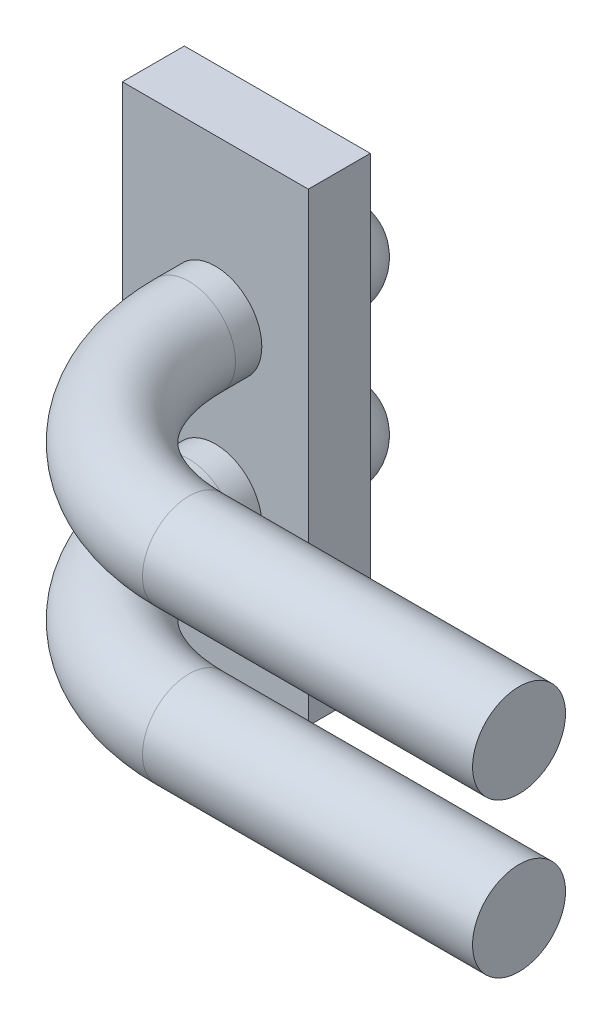
ISO-10303-21;
HEADER;
FILE_DESCRIPTION(('STEP AP214'),'2;1');
FILE_NAME('part.step','',(''),(''),'','','');
FILE_SCHEMA(('AUTOMOTIVE_DESIGN { 1 0 10303 214 1 1 1 1 }'));
ENDSEC;
DATA;
#1=APPLICATION_CONTEXT('core data for automotive mechanical design processes');
#2=APPLICATION_PROTOCOL_DEFINITION('international standard','automotive_design',2000,#1);
#3=PRODUCT_CONTEXT('',#1,'mechanical');
#4=PRODUCT('Part','Part','',(#3));
#5=PRODUCT_RELATED_PRODUCT_CATEGORY('part','',(#4));
#6=PRODUCT_DEFINITION_FORMATION('','',#4);
#7=PRODUCT_DEFINITION_CONTEXT('part definition',#1,'design');
#8=PRODUCT_DEFINITION('design','',#6,#7);
#9=PRODUCT_DEFINITION_SHAPE('','',#8);
#10=(LENGTH_UNIT() NAMED_UNIT(*) SI_UNIT(.MILLI.,.METRE.));
#11=(NAMED_UNIT(*) PLANE_ANGLE_UNIT() SI_UNIT($,.RADIAN.));
#12=(NAMED_UNIT(*) SI_UNIT($,.STERADIAN.) SOLID_ANGLE_UNIT());
#13=UNCERTAINTY_MEASURE_WITH_UNIT(LENGTH_MEASURE(1.E-05),#10,'distance_accuracy_value','');
#14=(GEOMETRIC_REPRESENTATION_CONTEXT(3) GLOBAL_UNCERTAINTY_ASSIGNED_CONTEXT((#13)) GLOBAL_UNIT_ASSIGNED_CONTEXT((#10,
#11,#12)) REPRESENTATION_CONTEXT('',''));
#15=CARTESIAN_POINT('',(0.,0.,0.));
#16=DIRECTION('',(0.,0.,1.));
#17=DIRECTION('',(1.,0.,0.));
#18=AXIS2_PLACEMENT_3D('',#15,#16,#17);
#19=CARTESIAN_POINT('',(3.00000000000001,7.5,2.));
#20=DIRECTION('',(0.,0.,-1.));
#21=DIRECTION('',(-1.,0.,0.));
#22=AXIS2_PLACEMENT_3D('',#19,#20,#21);
#23=PLANE('',#22);
#24=CARTESIAN_POINT('',(0.,-2.62,2.));
#25=DIRECTION('',(0.,0.,1.));
#26=DIRECTION('',(1.,0.,0.));
#27=AXIS2_PLACEMENT_3D('',#24,#25,#26);
#28=CIRCLE('',#27,1.5);
#29=CARTESIAN_POINT('',(1.5,-2.62,2.));
#30=VERTEX_POINT('',#29);
#31=EDGE_CURVE('E41',#30,#30,#28,.T.);
#32=ORIENTED_EDGE('',*,*,#31,.F.);
#33=EDGE_LOOP('',(#32));
#34=FACE_BOUND('',#33,.T.);
#35=DIRECTION('',(0.,1.,0.));
#36=VECTOR('',#35,1.);
#37=CARTESIAN_POINT('',(3.00000000000001,-7.5,2.));
#38=LINE('',#37,#36);
#39=CARTESIAN_POINT('',(3.00000000000001,-7.5,2.));
#40=VERTEX_POINT('',#39);
#41=CARTESIAN_POINT('',(3.00000000000001,7.5,2.));
#42=VERTEX_POINT('',#41);
#43=EDGE_CURVE('E86',#40,#42,#38,.T.);
#44=ORIENTED_EDGE('',*,*,#43,.T.);
#45=DIRECTION('',(-1.,0.,0.));
#46=VECTOR('',#45,1.);
#47=CARTESIAN_POINT('',(-3.,7.5,2.));
#48=LINE('',#47,#46);
#49=CARTESIAN_POINT('',(-3.,7.5,2.));
#50=VERTEX_POINT('',#49);
#51=EDGE_CURVE('E81',#42,#50,#48,.T.);
#52=ORIENTED_EDGE('',*,*,#51,.T.);
#53=DIRECTION('',(0.,-1.,0.));
#54=VECTOR('',#53,1.);
#55=CARTESIAN_POINT('',(-3.,-7.5,2.));
#56=LINE('',#55,#54);
#57=CARTESIAN_POINT('',(-3.,-7.5,2.));
#58=VERTEX_POINT('',#57);
#59=EDGE_CURVE('E84',#50,#58,#56,.T.);
#60=ORIENTED_EDGE('',*,*,#59,.T.);
#61=DIRECTION('',(1.,0.,0.));
#62=VECTOR('',#61,1.);
#63=CARTESIAN_POINT('',(-3.,-7.5,2.));
#64=LINE('',#63,#62);
#65=EDGE_CURVE('E50',#58,#40,#64,.T.);
#66=ORIENTED_EDGE('',*,*,#65,.T.);
#67=EDGE_LOOP('',(#44,#52,#60,#66));
#68=FACE_BOUND('',#67,.T.);
#69=CARTESIAN_POINT('',(0.,2.35,2.));
#70=DIRECTION('',(0.,0.,1.));
#71=DIRECTION('',(1.,0.,0.));
#72=AXIS2_PLACEMENT_3D('',#69,#70,#71);
#73=CIRCLE('',#72,1.5);
#74=CARTESIAN_POINT('',(1.5,2.35,2.));
#75=VERTEX_POINT('',#74);
#76=EDGE_CURVE('E11',#75,#75,#73,.T.);
#77=ORIENTED_EDGE('',*,*,#76,.F.);
#78=EDGE_LOOP('',(#77));
#79=FACE_BOUND('',#78,.T.);
#80=ADVANCED_FACE('F31',(#34,#68,#79),#23,.F.);
#81=CARTESIAN_POINT('',(3.00000000000001,7.5,0.));
#82=DIRECTION('',(0.,0.,-1.));
#83=DIRECTION('',(-1.,0.,0.));
#84=AXIS2_PLACEMENT_3D('',#81,#82,#83);
#85=PLANE('',#84);
#86=CARTESIAN_POINT('',(0.,2.35,0.));
#87=DIRECTION('',(0.,0.,-1.));
#88=DIRECTION('',(-1.,0.,0.));
#89=AXIS2_PLACEMENT_3D('',#86,#87,#88);
#90=CIRCLE('',#89,1.5);
#91=CARTESIAN_POINT('',(-1.5,2.35,0.));
#92=VERTEX_POINT('',#91);
#93=EDGE_CURVE('E104',#92,#92,#90,.T.);
#94=ORIENTED_EDGE('',*,*,#93,.F.);
#95=EDGE_LOOP('',(#94));
#96=FACE_BOUND('',#95,.T.);
#97=DIRECTION('',(0.,1.,0.));
#98=VECTOR('',#97,1.);
#99=CARTESIAN_POINT('',(3.00000000000001,-7.5,0.));
#100=LINE('',#99,#98);
#101=CARTESIAN_POINT('',(3.00000000000001,-7.5,0.));
#102=VERTEX_POINT('',#101);
#103=CARTESIAN_POINT('',(3.00000000000001,7.5,0.));
#104=VERTEX_POINT('',#103);
#105=EDGE_CURVE('E101',#102,#104,#100,.T.);
#106=ORIENTED_EDGE('',*,*,#105,.F.);
#107=DIRECTION('',(1.,0.,0.));
#108=VECTOR('',#107,1.);
#109=CARTESIAN_POINT('',(-3.,-7.5,0.));
#110=LINE('',#109,#108);
#111=CARTESIAN_POINT('',(-3.,-7.5,0.));
#112=VERTEX_POINT('',#111);
#113=EDGE_CURVE('E73',#112,#102,#110,.T.);
#114=ORIENTED_EDGE('',*,*,#113,.F.);
#115=DIRECTION('',(0.,-1.,0.));
#116=VECTOR('',#115,1.);
#117=CARTESIAN_POINT('',(-3.,-7.5,0.));
#118=LINE('',#117,#116);
#119=CARTESIAN_POINT('',(-3.,7.5,0.));
#120=VERTEX_POINT('',#119);
#121=EDGE_CURVE('E67',#120,#112,#118,.T.);
#122=ORIENTED_EDGE('',*,*,#121,.F.);
#123=DIRECTION('',(-1.,0.,0.));
#124=VECTOR('',#123,1.);
#125=CARTESIAN_POINT('',(-3.,7.5,0.));
#126=LINE('',#125,#124);
#127=EDGE_CURVE('E91',#104,#120,#126,.T.);
#128=ORIENTED_EDGE('',*,*,#127,.F.);
#129=EDGE_LOOP('',(#106,#114,#122,#128));
#130=FACE_BOUND('',#129,.T.);
#131=CARTESIAN_POINT('',(0.,-2.62,0.));
#132=DIRECTION('',(0.,0.,-1.));
#133=DIRECTION('',(-1.,0.,0.));
#134=AXIS2_PLACEMENT_3D('',#131,#132,#133);
#135=CIRCLE('',#134,1.5);
#136=CARTESIAN_POINT('',(-1.5,-2.62,0.));
#137=VERTEX_POINT('',#136);
#138=EDGE_CURVE('E131',#137,#137,#135,.T.);
#139=ORIENTED_EDGE('',*,*,#138,.F.);
#140=EDGE_LOOP('',(#139));
#141=FACE_BOUND('',#140,.T.);
#142=ADVANCED_FACE('F139',(#96,#130,#141),#85,.T.);
#143=CARTESIAN_POINT('',(3.00000000000001,-7.5,2.));
#144=DIRECTION('',(-1.,0.,0.));
#145=DIRECTION('',(0.,0.,1.));
#146=AXIS2_PLACEMENT_3D('',#143,#144,#145);
#147=PLANE('',#146);
#148=ORIENTED_EDGE('',*,*,#105,.T.);
#149=DIRECTION('',(0.,0.,-1.));
#150=VECTOR('',#149,1.);
#151=CARTESIAN_POINT('',(3.00000000000001,7.5,2.));
#152=LINE('',#151,#150);
#153=EDGE_CURVE('E92',#42,#104,#152,.T.);
#154=ORIENTED_EDGE('',*,*,#153,.F.);
#155=ORIENTED_EDGE('',*,*,#43,.F.);
#156=DIRECTION('',(0.,0.,-1.));
#157=VECTOR('',#156,1.);
#158=CARTESIAN_POINT('',(3.00000000000001,-7.5,2.));
#159=LINE('',#158,#157);
#160=EDGE_CURVE('E97',#40,#102,#159,.T.);
#161=ORIENTED_EDGE('',*,*,#160,.T.);
#162=EDGE_LOOP('',(#148,#154,#155,#161));
#163=FACE_BOUND('',#162,.T.);
#164=ADVANCED_FACE('F142',(#163),#147,.F.);
#165=CARTESIAN_POINT('',(-3.,7.5,2.));
#166=DIRECTION('',(0.,-1.,0.));
#167=DIRECTION('',(0.,0.,-1.));
#168=AXIS2_PLACEMENT_3D('',#165,#166,#167);
#169=PLANE('',#168);
#170=ORIENTED_EDGE('',*,*,#127,.T.);
#171=DIRECTION('',(0.,0.,-1.));
#172=VECTOR('',#171,1.);
#173=CARTESIAN_POINT('',(-3.,7.5,2.));
#174=LINE('',#173,#172);
#175=EDGE_CURVE('E89',#50,#120,#174,.T.);
#176=ORIENTED_EDGE('',*,*,#175,.F.);
#177=ORIENTED_EDGE('',*,*,#51,.F.);
#178=ORIENTED_EDGE('',*,*,#153,.T.);
#179=EDGE_LOOP('',(#170,#176,#177,#178));
#180=FACE_BOUND('',#179,.T.);
#181=ADVANCED_FACE('F90',(#180),#169,.F.);
#182=CARTESIAN_POINT('',(-3.,-7.5,2.));
#183=DIRECTION('',(1.,0.,0.));
#184=DIRECTION('',(0.,0.,-1.));
#185=AXIS2_PLACEMENT_3D('',#182,#183,#184);
#186=PLANE('',#185);
#187=ORIENTED_EDGE('',*,*,#121,.T.);
#188=DIRECTION('',(0.,0.,-1.));
#189=VECTOR('',#188,1.);
#190=CARTESIAN_POINT('',(-3.,-7.5,2.));
#191=LINE('',#190,#189);
#192=EDGE_CURVE('E93',#58,#112,#191,.T.);
#193=ORIENTED_EDGE('',*,*,#192,.F.);
#194=ORIENTED_EDGE('',*,*,#59,.F.);
#195=ORIENTED_EDGE('',*,*,#175,.T.);
#196=EDGE_LOOP('',(#187,#193,#194,#195));
#197=FACE_BOUND('',#196,.T.);
#198=ADVANCED_FACE('F95',(#197),#186,.F.);
#199=CARTESIAN_POINT('',(-3.,-7.5,2.));
#200=DIRECTION('',(0.,1.,0.));
#201=DIRECTION('',(0.,0.,1.));
#202=AXIS2_PLACEMENT_3D('',#199,#200,#201);
#203=PLANE('',#202);
#204=ORIENTED_EDGE('',*,*,#113,.T.);
#205=ORIENTED_EDGE('',*,*,#160,.F.);
#206=ORIENTED_EDGE('',*,*,#65,.F.);
#207=ORIENTED_EDGE('',*,*,#192,.T.);
#208=EDGE_LOOP('',(#204,#205,#206,#207));
#209=FACE_BOUND('',#208,.T.);
#210=ADVANCED_FACE('F157',(#209),#203,.F.);
#211=CARTESIAN_POINT('',(0.,2.35,-3.));
#212=DIRECTION('',(0.,0.,1.));
#213=DIRECTION('',(1.,0.,0.));
#214=AXIS2_PLACEMENT_3D('',#211,#212,#213);
#215=CYLINDRICAL_SURFACE('',#214,1.5);
#216=CARTESIAN_POINT('',(0.,2.35,-1.5));
#217=DIRECTION('',(0.,0.,1.));
#218=DIRECTION('',(1.,0.,0.));
#219=AXIS2_PLACEMENT_3D('',#216,#217,#218);
#220=CIRCLE('',#219,1.5);
#221=CARTESIAN_POINT('',(1.5,2.35,-1.5));
#222=VERTEX_POINT('',#221);
#223=EDGE_CURVE('E35',#222,#222,#220,.T.);
#224=ORIENTED_EDGE('',*,*,#223,.T.);
#225=EDGE_LOOP('',(#224));
#226=FACE_BOUND('',#225,.T.);
#227=ORIENTED_EDGE('',*,*,#93,.T.);
#228=EDGE_LOOP('',(#227));
#229=FACE_BOUND('',#228,.T.);
#230=ADVANCED_FACE('F137',(#226,#229),#215,.T.);
#231=CARTESIAN_POINT('',(0.,-2.62,-3.));
#232=DIRECTION('',(0.,0.,1.));
#233=DIRECTION('',(1.,0.,0.));
#234=AXIS2_PLACEMENT_3D('',#231,#232,#233);
#235=CYLINDRICAL_SURFACE('',#234,1.5);
#236=CARTESIAN_POINT('',(0.,-2.62,-1.5));
#237=DIRECTION('',(0.,0.,1.));
#238=DIRECTION('',(1.,0.,0.));
#239=AXIS2_PLACEMENT_3D('',#236,#237,#238);
#240=CIRCLE('',#239,1.5);
#241=CARTESIAN_POINT('',(1.5,-2.62,-1.5));
#242=VERTEX_POINT('',#241);
#243=EDGE_CURVE('E110',#242,#242,#240,.T.);
#244=ORIENTED_EDGE('',*,*,#243,.T.);
#245=EDGE_LOOP('',(#244));
#246=FACE_BOUND('',#245,.T.);
#247=ORIENTED_EDGE('',*,*,#138,.T.);
#248=EDGE_LOOP('',(#247));
#249=FACE_BOUND('',#248,.T.);
#250=ADVANCED_FACE('F148',(#246,#249),#235,.T.);
#251=CARTESIAN_POINT('',(0.,-2.62,-1.5));
#252=DIRECTION('',(0.,0.,1.));
#253=DIRECTION('',(1.,0.,0.));
#254=AXIS2_PLACEMENT_3D('',#251,#252,#253);
#255=SPHERICAL_SURFACE('',#254,1.5);
#256=ORIENTED_EDGE('',*,*,#243,.F.);
#257=EDGE_LOOP('',(#256));
#258=FACE_BOUND('',#257,.T.);
#259=ADVANCED_FACE('F150',(#258),#255,.T.);
#260=CARTESIAN_POINT('',(0.,2.35,-1.5));
#261=DIRECTION('',(0.,0.,1.));
#262=DIRECTION('',(1.,0.,0.));
#263=AXIS2_PLACEMENT_3D('',#260,#261,#262);
#264=SPHERICAL_SURFACE('',#263,1.5);
#265=ORIENTED_EDGE('',*,*,#223,.F.);
#266=EDGE_LOOP('',(#265));
#267=FACE_BOUND('',#266,.T.);
#268=ADVANCED_FACE('F33',(#267),#264,.T.);
#269=CARTESIAN_POINT('',(6.,-2.62,8.85));
#270=DIRECTION('',(1.,0.,0.));
#271=DIRECTION('',(0.,0.,-1.));
#272=AXIS2_PLACEMENT_3D('',#269,#270,#271);
#273=CYLINDRICAL_SURFACE('',#272,1.5);
#274=CARTESIAN_POINT('',(6.,-2.62,8.85));
#275=DIRECTION('',(1.,0.,0.));
#276=DIRECTION('',(0.,0.,-1.));
#277=AXIS2_PLACEMENT_3D('',#274,#275,#276);
#278=CIRCLE('',#277,1.5);
#279=CARTESIAN_POINT('',(6.,-2.62,10.35));
#280=VERTEX_POINT('',#279);
#281=EDGE_CURVE('E125',#280,#280,#278,.T.);
#282=ORIENTED_EDGE('',*,*,#281,.T.);
#283=EDGE_LOOP('',(#282));
#284=FACE_BOUND('',#283,.T.);
#285=CARTESIAN_POINT('',(16.65,-2.62,8.85));
#286=DIRECTION('',(1.,0.,0.));
#287=DIRECTION('',(0.,0.,-1.));
#288=AXIS2_PLACEMENT_3D('',#285,#286,#287);
#289=CIRCLE('',#288,1.5);
#290=CARTESIAN_POINT('',(16.65,-2.62,7.35));
#291=VERTEX_POINT('',#290);
#292=EDGE_CURVE('E128',#291,#291,#289,.T.);
#293=ORIENTED_EDGE('',*,*,#292,.F.);
#294=EDGE_LOOP('',(#293));
#295=FACE_BOUND('',#294,.T.);
#296=ADVANCED_FACE('F214',(#284,#295),#273,.T.);
#297=CARTESIAN_POINT('',(6.,-2.62,2.85));
#298=DIRECTION('',(0.,1.,0.));
#299=DIRECTION('',(0.,0.,1.));
#300=AXIS2_PLACEMENT_3D('',#297,#298,#299);
#301=TOROIDAL_SURFACE('',#300,6.,1.5);
#302=CARTESIAN_POINT('',(0.,-2.62,2.85));
#303=DIRECTION('',(0.,0.,1.));
#304=DIRECTION('',(1.,0.,0.));
#305=AXIS2_PLACEMENT_3D('',#302,#303,#304);
#306=CIRCLE('',#305,1.5);
#307=CARTESIAN_POINT('',(-1.5,-2.62,2.85));
#308=VERTEX_POINT('',#307);
#309=EDGE_CURVE('E123',#308,#308,#306,.T.);
#310=CARTESIAN_POINT('',(6.,-2.62,2.85));
#311=DIRECTION('',(0.,1.,0.));
#312=DIRECTION('',(0.,0.,1.));
#313=AXIS2_PLACEMENT_3D('',#310,#311,#312);
#314=CIRCLE('',#313,7.5);
#315=EDGE_CURVE('',#308,#280,#314,.T.);
#316=ORIENTED_EDGE('',*,*,#309,.T.);
#317=ORIENTED_EDGE('',*,*,#281,.F.);
#318=ORIENTED_EDGE('',*,*,#315,.T.);
#319=ORIENTED_EDGE('',*,*,#315,.F.);
#320=EDGE_LOOP('',(#316,#318,#317,#319));
#321=FACE_BOUND('',#320,.T.);
#322=ADVANCED_FACE('F228',(#321),#301,.T.);
#323=CARTESIAN_POINT('',(0.,-2.62,2.85));
#324=DIRECTION('',(0.,0.,-1.));
#325=DIRECTION('',(-1.,0.,0.));
#326=AXIS2_PLACEMENT_3D('',#323,#324,#325);
#327=CYLINDRICAL_SURFACE('',#326,1.5);
#328=ORIENTED_EDGE('',*,*,#309,.F.);
#329=EDGE_LOOP('',(#328));
#330=FACE_BOUND('',#329,.T.);
#331=ORIENTED_EDGE('',*,*,#31,.T.);
#332=EDGE_LOOP('',(#331));
#333=FACE_BOUND('',#332,.T.);
#334=ADVANCED_FACE('F237',(#330,#333),#327,.T.);
#335=CARTESIAN_POINT('',(16.65,-2.62,8.85));
#336=DIRECTION('',(1.,0.,0.));
#337=DIRECTION('',(0.,0.,-1.));
#338=AXIS2_PLACEMENT_3D('',#335,#336,#337);
#339=PLANE('',#338);
#340=ORIENTED_EDGE('',*,*,#292,.T.);
#341=EDGE_LOOP('',(#340));
#342=FACE_BOUND('',#341,.T.);
#343=ADVANCED_FACE('F247',(#342),#339,.T.);
#344=CARTESIAN_POINT('',(6.,2.35,8.85));
#345=DIRECTION('',(1.,0.,0.));
#346=DIRECTION('',(0.,0.,-1.));
#347=AXIS2_PLACEMENT_3D('',#344,#345,#346);
#348=CYLINDRICAL_SURFACE('',#347,1.5);
#349=CARTESIAN_POINT('',(6.,2.35,8.85));
#350=DIRECTION('',(1.,0.,0.));
#351=DIRECTION('',(0.,0.,-1.));
#352=AXIS2_PLACEMENT_3D('',#349,#350,#351);
#353=CIRCLE('',#352,1.5);
#354=CARTESIAN_POINT('',(6.,2.35,10.35));
#355=VERTEX_POINT('',#354);
#356=EDGE_CURVE('E305',#355,#355,#353,.T.);
#357=ORIENTED_EDGE('',*,*,#356,.T.);
#358=EDGE_LOOP('',(#357));
#359=FACE_BOUND('',#358,.T.);
#360=CARTESIAN_POINT('',(16.65,2.35,8.85));
#361=DIRECTION('',(1.,0.,0.));
#362=DIRECTION('',(0.,0.,-1.));
#363=AXIS2_PLACEMENT_3D('',#360,#361,#362);
#364=CIRCLE('',#363,1.5);
#365=CARTESIAN_POINT('',(16.65,2.35,7.35));
#366=VERTEX_POINT('',#365);
#367=EDGE_CURVE('E303',#366,#366,#364,.T.);
#368=ORIENTED_EDGE('',*,*,#367,.F.);
#369=EDGE_LOOP('',(#368));
#370=FACE_BOUND('',#369,.T.);
#371=ADVANCED_FACE('F257',(#359,#370),#348,.T.);
#372=CARTESIAN_POINT('',(6.,2.35,2.85));
#373=DIRECTION('',(0.,1.,0.));
#374=DIRECTION('',(0.,0.,1.));
#375=AXIS2_PLACEMENT_3D('',#372,#373,#374);
#376=TOROIDAL_SURFACE('',#375,6.,1.5);
#377=CARTESIAN_POINT('',(0.,2.35,2.85));
#378=DIRECTION('',(0.,0.,1.));
#379=DIRECTION('',(1.,0.,0.));
#380=AXIS2_PLACEMENT_3D('',#377,#378,#379);
#381=CIRCLE('',#380,1.5);
#382=CARTESIAN_POINT('',(-1.5,2.35,2.85));
#383=VERTEX_POINT('',#382);
#384=EDGE_CURVE('E308',#383,#383,#381,.T.);
#385=CARTESIAN_POINT('',(6.,2.35,2.85));
#386=DIRECTION('',(0.,1.,0.));
#387=DIRECTION('',(0.,0.,1.));
#388=AXIS2_PLACEMENT_3D('',#385,#386,#387);
#389=CIRCLE('',#388,7.5);
#390=EDGE_CURVE('',#383,#355,#389,.T.);
#391=ORIENTED_EDGE('',*,*,#384,.T.);
#392=ORIENTED_EDGE('',*,*,#356,.F.);
#393=ORIENTED_EDGE('',*,*,#390,.T.);
#394=ORIENTED_EDGE('',*,*,#390,.F.);
#395=EDGE_LOOP('',(#391,#393,#392,#394));
#396=FACE_BOUND('',#395,.T.);
#397=ADVANCED_FACE('F267',(#396),#376,.T.);
#398=CARTESIAN_POINT('',(0.,2.35,2.85));
#399=DIRECTION('',(0.,0.,-1.));
#400=DIRECTION('',(-1.,0.,0.));
#401=AXIS2_PLACEMENT_3D('',#398,#399,#400);
#402=CYLINDRICAL_SURFACE('',#401,1.5);
#403=ORIENTED_EDGE('',*,*,#384,.F.);
#404=EDGE_LOOP('',(#403));
#405=FACE_BOUND('',#404,.T.);
#406=ORIENTED_EDGE('',*,*,#76,.T.);
#407=EDGE_LOOP('',(#406));
#408=FACE_BOUND('',#407,.T.);
#409=ADVANCED_FACE('F277',(#405,#408),#402,.T.);
#410=CARTESIAN_POINT('',(16.65,2.35,8.85));
#411=DIRECTION('',(1.,0.,0.));
#412=DIRECTION('',(0.,0.,-1.));
#413=AXIS2_PLACEMENT_3D('',#410,#411,#412);
#414=PLANE('',#413);
#415=ORIENTED_EDGE('',*,*,#367,.T.);
#416=EDGE_LOOP('',(#415));
#417=FACE_BOUND('',#416,.T.);
#418=ADVANCED_FACE('F287',(#417),#414,.T.);
#419=CLOSED_SHELL('',(#80,#142,#164,#181,#198,#210,#230,#250,#259,#268,#296,#322,#334,#343,#371,
#397,#409,#418));
#420=MANIFOLD_SOLID_BREP('B2',#419);
#421=ADVANCED_BREP_SHAPE_REPRESENTATION('',(#18,#420),#14);
#422=SHAPE_DEFINITION_REPRESENTATION(#9,#421);
ENDSEC;
END-ISO-10303-21;
